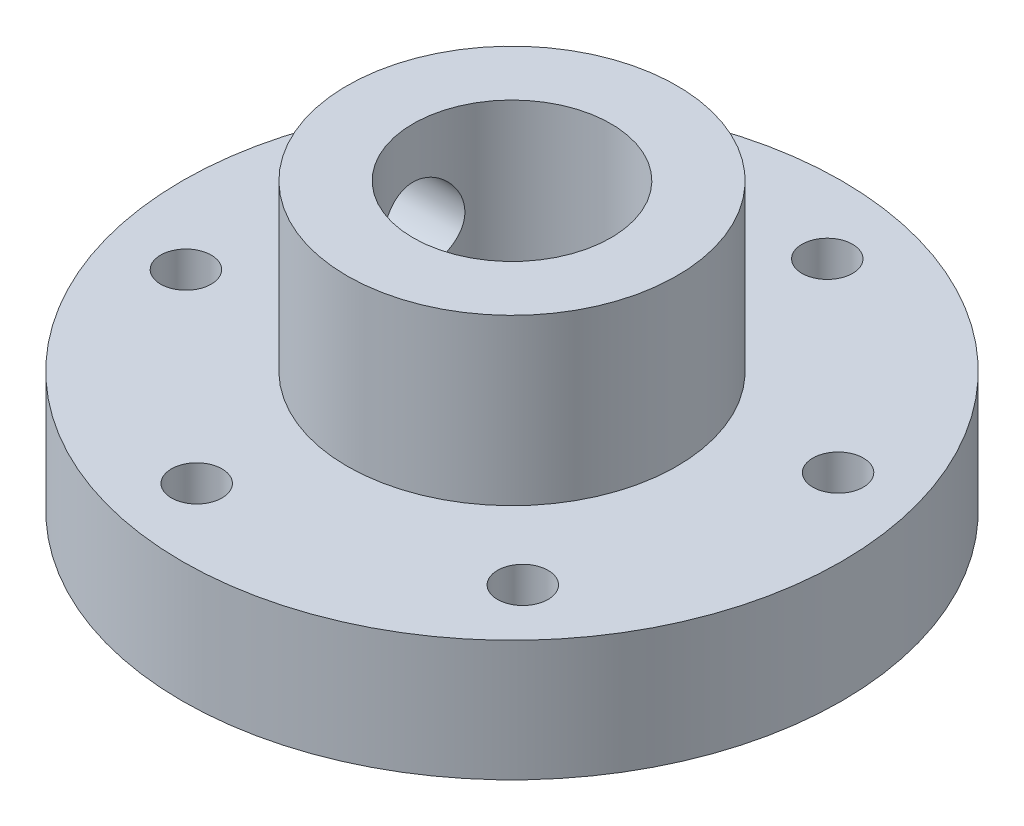
ISO-10303-21;
HEADER;
FILE_DESCRIPTION(('STEP AP214'),'2;1');
FILE_NAME('part.step','',(''),(''),'','','');
FILE_SCHEMA(('AUTOMOTIVE_DESIGN { 1 0 10303 214 1 1 1 1 }'));
ENDSEC;
DATA;
#1=APPLICATION_CONTEXT('core data for automotive mechanical design processes');
#2=APPLICATION_PROTOCOL_DEFINITION('international standard','automotive_design',2000,#1);
#3=PRODUCT_CONTEXT('',#1,'mechanical');
#4=PRODUCT('Part','Part','',(#3));
#5=PRODUCT_RELATED_PRODUCT_CATEGORY('part','',(#4));
#6=PRODUCT_DEFINITION_FORMATION('','',#4);
#7=PRODUCT_DEFINITION_CONTEXT('part definition',#1,'design');
#8=PRODUCT_DEFINITION('design','',#6,#7);
#9=PRODUCT_DEFINITION_SHAPE('','',#8);
#10=(LENGTH_UNIT() NAMED_UNIT(*) SI_UNIT(.MILLI.,.METRE.));
#11=(NAMED_UNIT(*) PLANE_ANGLE_UNIT() SI_UNIT($,.RADIAN.));
#12=(NAMED_UNIT(*) SI_UNIT($,.STERADIAN.) SOLID_ANGLE_UNIT());
#13=UNCERTAINTY_MEASURE_WITH_UNIT(LENGTH_MEASURE(1.E-05),#10,'distance_accuracy_value','');
#14=(GEOMETRIC_REPRESENTATION_CONTEXT(3) GLOBAL_UNCERTAINTY_ASSIGNED_CONTEXT((#13)) GLOBAL_UNIT_ASSIGNED_CONTEXT((#10,
#11,#12)) REPRESENTATION_CONTEXT('',''));
#15=CARTESIAN_POINT('',(0.,0.,0.));
#16=DIRECTION('',(0.,0.,1.));
#17=DIRECTION('',(1.,0.,0.));
#18=AXIS2_PLACEMENT_3D('',#15,#16,#17);
#19=CARTESIAN_POINT('',(0.,26.,0.));
#20=DIRECTION('',(0.,-1.,0.));
#21=DIRECTION('',(0.,0.,-1.));
#22=AXIS2_PLACEMENT_3D('',#19,#20,#21);
#23=CYLINDRICAL_SURFACE('',#22,15.);
#24=CARTESIAN_POINT('',(-14.4974997844456,17.55,-3.85));
#25=CARTESIAN_POINT('',(-14.4975037139503,17.3376015203786,-3.84999430899395));
#26=CARTESIAN_POINT('',(-14.5022184571044,17.1251411774259,-3.83236358588988));
#27=CARTESIAN_POINT('',(-14.520516628721,16.7063352871304,-3.76242726631808));
#28=CARTESIAN_POINT('',(-14.5341049370814,16.4999931697351,-3.71010259013421));
#29=CARTESIAN_POINT('',(-14.5685121748504,16.0995423274894,-3.57259453015927));
#30=CARTESIAN_POINT('',(-14.5893214406448,15.9054176604835,-3.4874550447748));
#31=CARTESIAN_POINT('',(-14.6358137715695,15.534182337845,-3.28686941082969));
#32=CARTESIAN_POINT('',(-14.6614971117621,15.3570726432809,-3.17142155171345));
#33=CARTESIAN_POINT('',(-14.7155105887127,15.0207885395624,-2.91063601549345));
#34=CARTESIAN_POINT('',(-14.7438848587797,14.862066889047,-2.76472352815352));
#35=CARTESIAN_POINT('',(-14.799701043376,14.5710584910169,-2.4483880228334));
#36=CARTESIAN_POINT('',(-14.8271428668753,14.4387743183393,-2.27796262023287));
#37=CARTESIAN_POINT('',(-14.8784921458645,14.2025295636584,-1.91432245364396));
#38=CARTESIAN_POINT('',(-14.9023414551622,14.0990158607544,-1.72080844506311));
#39=CARTESIAN_POINT('',(-14.9433139052101,13.9261594865703,-1.31841121467282));
#40=CARTESIAN_POINT('',(-14.9604380937017,13.8568114920092,-1.10953039296401));
#41=CARTESIAN_POINT('',(-14.98571884976,13.7557112160842,-0.687051274584021));
#42=CARTESIAN_POINT('',(-14.9940586719199,13.7231895524239,-0.473648249319008));
#43=CARTESIAN_POINT('',(-15.001470456539,13.6942478743522,-0.0442632423387412));
#44=CARTESIAN_POINT('',(-15.0005438602807,13.6978222456277,0.17171833309387));
#45=CARTESIAN_POINT('',(-14.9896627828382,13.7404223538562,0.594785918147083));
#46=CARTESIAN_POINT('',(-14.9799198720509,13.7786173156604,0.801961846365691));
#47=CARTESIAN_POINT('',(-14.9527485285787,13.888036360168,1.20685930692514));
#48=CARTESIAN_POINT('',(-14.9353196747754,13.9592622526708,1.40458032056642));
#49=CARTESIAN_POINT('',(-14.894414981847,14.1333794895608,1.78711738569415));
#50=CARTESIAN_POINT('',(-14.8708838501515,14.2365621475402,1.97179468629045));
#51=CARTESIAN_POINT('',(-14.8203204300093,14.4714419522582,2.32150106617554));
#52=CARTESIAN_POINT('',(-14.7932875036395,14.6031442973811,2.48652655494847));
#53=CARTESIAN_POINT('',(-14.7377511083542,14.8957615872166,2.79720131836368));
#54=CARTESIAN_POINT('',(-14.709227686086,15.0574019968988,2.94216448659244));
#55=CARTESIAN_POINT('',(-14.6546260480011,15.4029960697932,3.203085215457));
#56=CARTESIAN_POINT('',(-14.6285479595765,15.5869508943551,3.31904126546007));
#57=CARTESIAN_POINT('',(-14.5817147172228,15.973353354542,3.51912772865034));
#58=CARTESIAN_POINT('',(-14.5609887727474,16.1758946181966,3.60308464229615));
#59=CARTESIAN_POINT('',(-14.5275762527471,16.5928792500669,3.73553816676361));
#60=CARTESIAN_POINT('',(-14.514887850762,16.8073199021972,3.78404283417946));
#61=CARTESIAN_POINT('',(-14.4993726775743,17.2356320920044,3.84305925622214));
#62=CARTESIAN_POINT('',(-14.4962817467733,17.4493539553203,3.85458900417279));
#63=CARTESIAN_POINT('',(-14.4995909869353,17.875669579587,3.84212226821067));
#64=CARTESIAN_POINT('',(-14.5059902312956,18.0882634486391,3.81812925267343));
#65=CARTESIAN_POINT('',(-14.5273048505549,18.5024526915833,3.7361925990618));
#66=CARTESIAN_POINT('',(-14.5420695510912,18.7041753026663,3.67884918015974));
#67=CARTESIAN_POINT('',(-14.5783067907539,19.0951428052326,3.5325086500853));
#68=CARTESIAN_POINT('',(-14.5997801570503,19.2843861545522,3.44350763538369));
#69=CARTESIAN_POINT('',(-14.6475658907816,19.6493152229506,3.23427284629789));
#70=CARTESIAN_POINT('',(-14.6739686497703,19.8246423159,3.11343469625331));
#71=CARTESIAN_POINT('',(-14.7284200895009,20.1529045659824,2.84471404476546));
#72=CARTESIAN_POINT('',(-14.7564690554265,20.3058358271983,2.69682684798375));
#73=CARTESIAN_POINT('',(-14.8119533250863,20.5891290069732,2.37351964867547));
#74=CARTESIAN_POINT('',(-14.8393526019766,20.7187844577081,2.19747324888323));
#75=CARTESIAN_POINT('',(-14.8896826089327,20.9466960698138,1.82551885201202));
#76=CARTESIAN_POINT('',(-14.9126135747932,21.0449538882265,1.62961190381267));
#77=CARTESIAN_POINT('',(-14.9512769936742,21.2064068060799,1.22486581191567));
#78=CARTESIAN_POINT('',(-14.9670619792425,21.2698585333664,1.01613429424665));
#79=CARTESIAN_POINT('',(-14.989885389569,21.3606590876231,0.590509527171724));
#80=CARTESIAN_POINT('',(-14.9969255999834,21.3880152852607,0.373617953346712));
#81=CARTESIAN_POINT('',(-15.0013888293896,21.4054149831773,-0.0555479586559406));
#82=CARTESIAN_POINT('',(-14.9990799277905,21.39649854191,-0.267777963172668));
#83=CARTESIAN_POINT('',(-14.9857034672328,21.3440011305838,-0.687609264505827));
#84=CARTESIAN_POINT('',(-14.9746361949315,21.3004212950411,-0.895210712584056));
#85=CARTESIAN_POINT('',(-14.9450326673483,21.1804042203817,-1.29873918191618));
#86=CARTESIAN_POINT('',(-14.9265412653498,21.1041641179781,-1.49472834185828));
#87=CARTESIAN_POINT('',(-14.8840311394528,20.9211681545754,-1.87124446236686));
#88=CARTESIAN_POINT('',(-14.8600116867476,20.8144082694622,-2.05176937984991));
#89=CARTESIAN_POINT('',(-14.8082764327646,20.5702816171444,-2.39712940196516));
#90=CARTESIAN_POINT('',(-14.7804831399987,20.4322154413138,-2.56145849232353));
#91=CARTESIAN_POINT('',(-14.7246671328675,20.1307409562635,-2.86496826967628));
#92=CARTESIAN_POINT('',(-14.6966443613523,19.9673261404028,-3.0041424798495));
#93=CARTESIAN_POINT('',(-14.6429030154051,19.6158702926653,-3.25612651514469));
#94=CARTESIAN_POINT('',(-14.6172415473049,19.4274030894694,-3.3683551239696));
#95=CARTESIAN_POINT('',(-14.5719109818221,19.0336422168708,-3.55936993771995));
#96=CARTESIAN_POINT('',(-14.5522376979598,18.8283604309518,-3.63817952189235));
#97=CARTESIAN_POINT('',(-14.5240520078445,18.4446584138712,-3.74893866089505));
#98=CARTESIAN_POINT('',(-14.514172029791,18.2680088297946,-3.78675159544319));
#99=CARTESIAN_POINT('',(-14.5008945592867,17.9109208100685,-3.83728348012284));
#100=CARTESIAN_POINT('',(-14.4974964454021,17.7304827393086,-3.85000483585553));
#101=CARTESIAN_POINT('',(-14.4974997844456,17.55,-3.85));
#102=B_SPLINE_CURVE_WITH_KNOTS('',3,(#24,#25,#26,#27,#28,#29,#30,#31,#32,#33,#34,#35,#36,#37,
#38,#39,#40,#41,#42,#43,#44,#45,#46,#47,#48,#49,#50,#51,#52,#53,#54,#55,#56,#57,#58,#59,#60,#61,
#62,#63,#64,#65,#66,#67,#68,#69,#70,#71,#72,#73,#74,#75,#76,#77,#78,#79,#80,#81,#82,#83,#84,#85,
#86,#87,#88,#89,#90,#91,#92,#93,#94,#95,#96,#97,#98,#99,#100,#101),.UNSPECIFIED.,.T.,.F.,(4,2,2,
2,2,2,2,2,2,2,2,2,2,2,2,2,2,2,2,2,2,2,2,2,2,2,2,2,2,2,2,2,2,2,2,2,2,2,4),(0.,0.636532312885022,
1.27341497328203,1.90944857694809,2.54551808504196,3.19489519736624,3.84433552397912,
4.50336166615769,5.16228509448039,5.8071723867436,6.45195937592793,7.08167181769272,
7.71141876613835,8.34708433633667,8.98286586922013,9.63676369351051,10.2906955644066,
10.9481242588056,11.6054035047209,12.2444238565188,12.8833818196909,13.5111812443457,
14.1390581064483,14.7798407481066,15.4207347264697,16.0786329564693,16.7364964594861,
17.389441958157,18.0422541054325,18.6764817995508,19.3106887365586,19.9411203879185,
20.5716352017304,21.2179368813546,21.864404732938,22.5237666838852,23.1826665950206,
23.723603194257,24.2644879298385),.UNSPECIFIED.);
#103=CARTESIAN_POINT('',(-14.4974997844456,17.55,-3.85));
#104=VERTEX_POINT('',#103);
#105=EDGE_CURVE('E68',#104,#104,#102,.T.);
#106=ORIENTED_EDGE('',*,*,#105,.F.);
#107=EDGE_LOOP('',(#106));
#108=FACE_BOUND('',#107,.T.);
#109=CARTESIAN_POINT('',(0.,11.,0.));
#110=DIRECTION('',(0.,1.,0.));
#111=DIRECTION('',(0.,0.,1.));
#112=AXIS2_PLACEMENT_3D('',#109,#110,#111);
#113=CIRCLE('',#112,15.);
#114=CARTESIAN_POINT('',(0.,11.,15.));
#115=VERTEX_POINT('',#114);
#116=EDGE_CURVE('E37',#115,#115,#113,.T.);
#117=ORIENTED_EDGE('',*,*,#116,.T.);
#118=EDGE_LOOP('',(#117));
#119=FACE_BOUND('',#118,.T.);
#120=CARTESIAN_POINT('',(0.,26.,0.));
#121=DIRECTION('',(0.,1.,0.));
#122=DIRECTION('',(0.,0.,1.));
#123=AXIS2_PLACEMENT_3D('',#120,#121,#122);
#124=CIRCLE('',#123,15.);
#125=CARTESIAN_POINT('',(0.,26.,15.));
#126=VERTEX_POINT('',#125);
#127=EDGE_CURVE('E10',#126,#126,#124,.T.);
#128=ORIENTED_EDGE('',*,*,#127,.F.);
#129=EDGE_LOOP('',(#128));
#130=FACE_BOUND('',#129,.T.);
#131=ADVANCED_FACE('F34',(#108,#119,#130),#23,.T.);
#132=CARTESIAN_POINT('',(0.,26.,0.));
#133=DIRECTION('',(0.,1.,0.));
#134=DIRECTION('',(0.,0.,1.));
#135=AXIS2_PLACEMENT_3D('',#132,#133,#134);
#136=PLANE('',#135);
#137=CARTESIAN_POINT('',(0.,26.,0.));
#138=DIRECTION('',(0.,1.,0.));
#139=DIRECTION('',(0.,0.,1.));
#140=AXIS2_PLACEMENT_3D('',#137,#138,#139);
#141=CIRCLE('',#140,9.);
#142=CARTESIAN_POINT('',(0.,26.,9.));
#143=VERTEX_POINT('',#142);
#144=EDGE_CURVE('E52',#143,#143,#141,.T.);
#145=ORIENTED_EDGE('',*,*,#144,.F.);
#146=EDGE_LOOP('',(#145));
#147=FACE_BOUND('',#146,.T.);
#148=ORIENTED_EDGE('',*,*,#127,.T.);
#149=EDGE_LOOP('',(#148));
#150=FACE_BOUND('',#149,.T.);
#151=ADVANCED_FACE('F150',(#147,#150),#136,.T.);
#152=CARTESIAN_POINT('',(0.,11.,0.));
#153=DIRECTION('',(0.,-1.,0.));
#154=DIRECTION('',(0.,0.,-1.));
#155=AXIS2_PLACEMENT_3D('',#152,#153,#154);
#156=CYLINDRICAL_SURFACE('',#155,30.);
#157=CARTESIAN_POINT('',(0.,11.,0.));
#158=DIRECTION('',(0.,1.,0.));
#159=DIRECTION('',(0.,0.,1.));
#160=AXIS2_PLACEMENT_3D('',#157,#158,#159);
#161=CIRCLE('',#160,30.);
#162=CARTESIAN_POINT('',(0.,11.,30.));
#163=VERTEX_POINT('',#162);
#164=EDGE_CURVE('E44',#163,#163,#161,.T.);
#165=ORIENTED_EDGE('',*,*,#164,.F.);
#166=EDGE_LOOP('',(#165));
#167=FACE_BOUND('',#166,.T.);
#168=CARTESIAN_POINT('',(0.,0.,0.));
#169=DIRECTION('',(0.,1.,0.));
#170=DIRECTION('',(0.,0.,1.));
#171=AXIS2_PLACEMENT_3D('',#168,#169,#170);
#172=CIRCLE('',#171,30.);
#173=CARTESIAN_POINT('',(0.,0.,30.));
#174=VERTEX_POINT('',#173);
#175=EDGE_CURVE('E46',#174,#174,#172,.T.);
#176=ORIENTED_EDGE('',*,*,#175,.T.);
#177=EDGE_LOOP('',(#176));
#178=FACE_BOUND('',#177,.T.);
#179=ADVANCED_FACE('F146',(#167,#178),#156,.T.);
#180=CARTESIAN_POINT('',(0.,11.,0.));
#181=DIRECTION('',(0.,1.,0.));
#182=DIRECTION('',(0.,0.,1.));
#183=AXIS2_PLACEMENT_3D('',#180,#181,#182);
#184=PLANE('',#183);
#185=CARTESIAN_POINT('',(-17.3377335773735,11.,-16.3550642424516));
#186=DIRECTION('',(0.,1.,0.));
#187=DIRECTION('',(0.86602540378444,0.,0.499999999999998));
#188=AXIS2_PLACEMENT_3D('',#185,#186,#187);
#189=CIRCLE('',#188,2.3);
#190=CARTESIAN_POINT('',(-15.3458751486692,11.,-15.2050642424516));
#191=VERTEX_POINT('',#190);
#192=EDGE_CURVE('E89',#191,#191,#189,.T.);
#193=ORIENTED_EDGE('',*,*,#192,.F.);
#194=EDGE_LOOP('',(#193));
#195=FACE_BOUND('',#194,.T.);
#196=CARTESIAN_POINT('',(-22.8327679031763,11.,6.83738560082613));
#197=DIRECTION('',(0.,1.,0.));
#198=DIRECTION('',(0.866025403784436,0.,-0.500000000000004));
#199=AXIS2_PLACEMENT_3D('',#196,#197,#198);
#200=CIRCLE('',#199,2.3);
#201=CARTESIAN_POINT('',(-20.8409094744721,11.,5.68738560082612));
#202=VERTEX_POINT('',#201);
#203=EDGE_CURVE('E83',#202,#202,#200,.T.);
#204=ORIENTED_EDGE('',*,*,#203,.F.);
#205=EDGE_LOOP('',(#204));
#206=FACE_BOUND('',#205,.T.);
#207=CARTESIAN_POINT('',(-5.49503432580289,11.,23.1924498432776));
#208=DIRECTION('',(0.,1.,0.));
#209=DIRECTION('',(0.,0.,-1.));
#210=AXIS2_PLACEMENT_3D('',#207,#208,#209);
#211=CIRCLE('',#210,2.3);
#212=CARTESIAN_POINT('',(-5.49503432580289,11.,20.8924498432776));
#213=VERTEX_POINT('',#212);
#214=EDGE_CURVE('E77',#213,#213,#211,.T.);
#215=ORIENTED_EDGE('',*,*,#214,.F.);
#216=EDGE_LOOP('',(#215));
#217=FACE_BOUND('',#216,.T.);
#218=CARTESIAN_POINT('',(17.3377335773736,11.,16.3550642424515));
#219=DIRECTION('',(0.,1.,0.));
#220=DIRECTION('',(-0.866025403784443,0.,-0.499999999999992));
#221=AXIS2_PLACEMENT_3D('',#218,#219,#220);
#222=CIRCLE('',#221,2.3);
#223=CARTESIAN_POINT('',(15.3458751486694,11.,15.2050642424515));
#224=VERTEX_POINT('',#223);
#225=EDGE_CURVE('E71',#224,#224,#222,.T.);
#226=ORIENTED_EDGE('',*,*,#225,.F.);
#227=EDGE_LOOP('',(#226));
#228=FACE_BOUND('',#227,.T.);
#229=CARTESIAN_POINT('',(22.8327679031762,11.,-6.83738560082629));
#230=DIRECTION('',(0.,1.,0.));
#231=DIRECTION('',(-0.866025403784433,0.,0.50000000000001));
#232=AXIS2_PLACEMENT_3D('',#229,#230,#231);
#233=CIRCLE('',#232,2.3);
#234=CARTESIAN_POINT('',(20.840909474472,11.,-5.68738560082627));
#235=VERTEX_POINT('',#234);
#236=EDGE_CURVE('E64',#235,#235,#233,.T.);
#237=ORIENTED_EDGE('',*,*,#236,.F.);
#238=EDGE_LOOP('',(#237));
#239=FACE_BOUND('',#238,.T.);
#240=CARTESIAN_POINT('',(5.49503432580289,11.,-23.1924498432776));
#241=DIRECTION('',(0.,1.,0.));
#242=DIRECTION('',(0.,0.,1.));
#243=AXIS2_PLACEMENT_3D('',#240,#241,#242);
#244=CIRCLE('',#243,2.3);
#245=CARTESIAN_POINT('',(5.49503432580289,11.,-20.8924498432776));
#246=VERTEX_POINT('',#245);
#247=EDGE_CURVE('E58',#246,#246,#244,.T.);
#248=ORIENTED_EDGE('',*,*,#247,.F.);
#249=EDGE_LOOP('',(#248));
#250=FACE_BOUND('',#249,.T.);
#251=ORIENTED_EDGE('',*,*,#116,.F.);
#252=EDGE_LOOP('',(#251));
#253=FACE_BOUND('',#252,.T.);
#254=ORIENTED_EDGE('',*,*,#164,.T.);
#255=EDGE_LOOP('',(#254));
#256=FACE_BOUND('',#255,.T.);
#257=ADVANCED_FACE('F143',(#195,#206,#217,#228,#239,#250,#253,#256),#184,.T.);
#258=CARTESIAN_POINT('',(0.,0.,0.));
#259=DIRECTION('',(0.,1.,0.));
#260=DIRECTION('',(0.,0.,1.));
#261=AXIS2_PLACEMENT_3D('',#258,#259,#260);
#262=PLANE('',#261);
#263=CARTESIAN_POINT('',(-17.3377335773735,0.,-16.3550642424516));
#264=DIRECTION('',(0.,1.,0.));
#265=DIRECTION('',(0.86602540378444,0.,0.499999999999998));
#266=AXIS2_PLACEMENT_3D('',#263,#264,#265);
#267=CIRCLE('',#266,2.3);
#268=CARTESIAN_POINT('',(-15.3458751486692,0.,-15.2050642424516));
#269=VERTEX_POINT('',#268);
#270=EDGE_CURVE('E61',#269,#269,#267,.T.);
#271=ORIENTED_EDGE('',*,*,#270,.T.);
#272=EDGE_LOOP('',(#271));
#273=FACE_BOUND('',#272,.T.);
#274=CARTESIAN_POINT('',(-22.8327679031763,0.,6.83738560082613));
#275=DIRECTION('',(0.,1.,0.));
#276=DIRECTION('',(0.866025403784436,0.,-0.500000000000004));
#277=AXIS2_PLACEMENT_3D('',#274,#275,#276);
#278=CIRCLE('',#277,2.3);
#279=CARTESIAN_POINT('',(-20.8409094744721,0.,5.68738560082612));
#280=VERTEX_POINT('',#279);
#281=EDGE_CURVE('E86',#280,#280,#278,.T.);
#282=ORIENTED_EDGE('',*,*,#281,.T.);
#283=EDGE_LOOP('',(#282));
#284=FACE_BOUND('',#283,.T.);
#285=CARTESIAN_POINT('',(-5.49503432580289,0.,23.1924498432776));
#286=DIRECTION('',(0.,1.,0.));
#287=DIRECTION('',(0.,0.,-1.));
#288=AXIS2_PLACEMENT_3D('',#285,#286,#287);
#289=CIRCLE('',#288,2.3);
#290=CARTESIAN_POINT('',(-5.49503432580289,0.,20.8924498432776));
#291=VERTEX_POINT('',#290);
#292=EDGE_CURVE('E80',#291,#291,#289,.T.);
#293=ORIENTED_EDGE('',*,*,#292,.T.);
#294=EDGE_LOOP('',(#293));
#295=FACE_BOUND('',#294,.T.);
#296=CARTESIAN_POINT('',(17.3377335773736,0.,16.3550642424515));
#297=DIRECTION('',(0.,1.,0.));
#298=DIRECTION('',(-0.866025403784443,0.,-0.499999999999992));
#299=AXIS2_PLACEMENT_3D('',#296,#297,#298);
#300=CIRCLE('',#299,2.3);
#301=CARTESIAN_POINT('',(15.3458751486694,0.,15.2050642424515));
#302=VERTEX_POINT('',#301);
#303=EDGE_CURVE('E74',#302,#302,#300,.T.);
#304=ORIENTED_EDGE('',*,*,#303,.T.);
#305=EDGE_LOOP('',(#304));
#306=FACE_BOUND('',#305,.T.);
#307=CARTESIAN_POINT('',(22.8327679031762,0.,-6.83738560082629));
#308=DIRECTION('',(0.,1.,0.));
#309=DIRECTION('',(-0.866025403784433,0.,0.50000000000001));
#310=AXIS2_PLACEMENT_3D('',#307,#308,#309);
#311=CIRCLE('',#310,2.3);
#312=CARTESIAN_POINT('',(20.840909474472,0.,-5.68738560082627));
#313=VERTEX_POINT('',#312);
#314=EDGE_CURVE('E67',#313,#313,#311,.T.);
#315=ORIENTED_EDGE('',*,*,#314,.T.);
#316=EDGE_LOOP('',(#315));
#317=FACE_BOUND('',#316,.T.);
#318=CARTESIAN_POINT('',(5.49503432580289,0.,-23.1924498432776));
#319=DIRECTION('',(0.,1.,0.));
#320=DIRECTION('',(0.,0.,1.));
#321=AXIS2_PLACEMENT_3D('',#318,#319,#320);
#322=CIRCLE('',#321,2.3);
#323=CARTESIAN_POINT('',(5.49503432580289,0.,-20.8924498432776));
#324=VERTEX_POINT('',#323);
#325=EDGE_CURVE('E55',#324,#324,#322,.T.);
#326=ORIENTED_EDGE('',*,*,#325,.T.);
#327=EDGE_LOOP('',(#326));
#328=FACE_BOUND('',#327,.T.);
#329=CARTESIAN_POINT('',(0.,0.,0.));
#330=DIRECTION('',(0.,1.,0.));
#331=DIRECTION('',(0.,0.,1.));
#332=AXIS2_PLACEMENT_3D('',#329,#330,#331);
#333=CIRCLE('',#332,9.);
#334=CARTESIAN_POINT('',(0.,0.,9.));
#335=VERTEX_POINT('',#334);
#336=EDGE_CURVE('E49',#335,#335,#333,.T.);
#337=ORIENTED_EDGE('',*,*,#336,.T.);
#338=EDGE_LOOP('',(#337));
#339=FACE_BOUND('',#338,.T.);
#340=ORIENTED_EDGE('',*,*,#175,.F.);
#341=EDGE_LOOP('',(#340));
#342=FACE_BOUND('',#341,.T.);
#343=ADVANCED_FACE('F141',(#273,#284,#295,#306,#317,#328,#339,#342),#262,.F.);
#344=CARTESIAN_POINT('',(0.,0.,0.));
#345=DIRECTION('',(0.,1.,0.));
#346=DIRECTION('',(0.,0.,1.));
#347=AXIS2_PLACEMENT_3D('',#344,#345,#346);
#348=CYLINDRICAL_SURFACE('',#347,9.);
#349=CARTESIAN_POINT('',(-8.13495543933708,17.55,-3.85));
#350=CARTESIAN_POINT('',(-8.1349562814349,17.6524312523983,-3.84999919988478));
#351=CARTESIAN_POINT('',(-8.13689690890917,17.754895890698,-3.84590602811421));
#352=CARTESIAN_POINT('',(-8.14459436774536,17.9590733297407,-3.82957713641106));
#353=CARTESIAN_POINT('',(-8.1503536040522,18.0607856158098,-3.81733628508284));
#354=CARTESIAN_POINT('',(-8.16550748809787,18.2628659650428,-3.78481320221164));
#355=CARTESIAN_POINT('',(-8.17490963600848,18.3632308100593,-3.76451437846277));
#356=CARTESIAN_POINT('',(-8.19702873719036,18.5616982610533,-3.71610283543133));
#357=CARTESIAN_POINT('',(-8.20974708977661,18.6597998929726,-3.68798681725065));
#358=CARTESIAN_POINT('',(-8.25215754786032,18.9488117434224,-3.59259967147734));
#359=CARTESIAN_POINT('',(-8.28619361323957,19.135517355984,-3.51411103051789));
#360=CARTESIAN_POINT('',(-8.36193444674092,19.4929621722662,-3.32985216216194));
#361=CARTESIAN_POINT('',(-8.40363768834868,19.6637045440356,-3.22408736369049));
#362=CARTESIAN_POINT('',(-8.49308235286607,19.9958166210063,-2.9808223565165));
#363=CARTESIAN_POINT('',(-8.54103548681777,20.1560219894256,-2.84180691188171));
#364=CARTESIAN_POINT('',(-8.63584021098423,20.4517051980444,-2.53917266907089));
#365=CARTESIAN_POINT('',(-8.68269135646897,20.587173199234,-2.37554412829742));
#366=CARTESIAN_POINT('',(-8.77260977109294,20.8356083463329,-2.01905782143798));
#367=CARTESIAN_POINT('',(-8.81540259736964,20.947248415335,-1.82519957000285));
#368=CARTESIAN_POINT('',(-8.88977410294051,21.1358226819096,-1.41929085343678));
#369=CARTESIAN_POINT('',(-8.92135801420945,21.2127730760942,-1.20724893341961));
#370=CARTESIAN_POINT('',(-8.96824967612307,21.3255111107019,-0.783248375130546));
#371=CARTESIAN_POINT('',(-8.98435065774373,21.3633135397196,-0.571915001760905));
#372=CARTESIAN_POINT('',(-9.00135353563875,21.4032081820046,-0.145333023989322));
#373=CARTESIAN_POINT('',(-9.00226195101378,21.4053157118886,0.0699138614376738));
#374=CARTESIAN_POINT('',(-8.98923345274841,21.3747827415668,0.483503347341973));
#375=CARTESIAN_POINT('',(-8.97624416079305,21.344360388984,0.68204527182749));
#376=CARTESIAN_POINT('',(-8.93819752059243,21.2534540093359,1.07088919649578));
#377=CARTESIAN_POINT('',(-8.91313928064248,21.1929677610129,1.26119058670069));
#378=CARTESIAN_POINT('',(-8.85287832872666,21.0429542054036,1.63166742736321));
#379=CARTESIAN_POINT('',(-8.81752625357953,20.9529966750869,1.81164337158245));
#380=CARTESIAN_POINT('',(-8.74010319698026,20.7470299849428,2.15441866925713));
#381=CARTESIAN_POINT('',(-8.69802980558589,20.6310114748134,2.31721182688722));
#382=CARTESIAN_POINT('',(-8.60769192592747,20.3662829385414,2.63376112685631));
#383=CARTESIAN_POINT('',(-8.55919968377037,20.2157932885637,2.78596607575638));
#384=CARTESIAN_POINT('',(-8.46377710461413,19.8913754420044,3.06367163292623));
#385=CARTESIAN_POINT('',(-8.41684744413966,19.7174372537036,3.189160798145));
#386=CARTESIAN_POINT('',(-8.32818529877439,19.3431382576775,3.4141641034592));
#387=CARTESIAN_POINT('',(-8.28670259797717,19.142048648893,3.51257289859854));
#388=CARTESIAN_POINT('',(-8.21664611941293,18.7239085382459,3.67348867694061));
#389=CARTESIAN_POINT('',(-8.188062536148,18.5068703064622,3.73602294066022));
#390=CARTESIAN_POINT('',(-8.14951067044971,18.0785661945476,3.8193532289855));
#391=CARTESIAN_POINT('',(-8.13841905165514,17.8678948482962,3.84267497859925));
#392=CARTESIAN_POINT('',(-8.13288991481515,17.4454019701394,3.85437020106798));
#393=CARTESIAN_POINT('',(-8.13844609596675,17.2335809036673,3.84275689601761));
#394=CARTESIAN_POINT('',(-8.16442092815148,16.8302425418703,3.78721966176508));
#395=CARTESIAN_POINT('',(-8.18378631637541,16.6383335101085,3.74558327610998));
#396=CARTESIAN_POINT('',(-8.23382480460214,16.2644057175734,3.63425717666648));
#397=CARTESIAN_POINT('',(-8.2645006442124,16.0823893652622,3.56456066580322));
#398=CARTESIAN_POINT('',(-8.3353204504403,15.7245694250091,3.39575193225376));
#399=CARTESIAN_POINT('',(-8.37581760812991,15.5493784849051,3.29549415933176));
#400=CARTESIAN_POINT('',(-8.46123953702969,15.2174363870074,3.0695279676191));
#401=CARTESIAN_POINT('',(-8.50616629056226,15.0606935545324,2.94380812733044));
#402=CARTESIAN_POINT('',(-8.60008325531371,14.7559436563054,2.65765383141866));
#403=CARTESIAN_POINT('',(-8.64908809286592,14.6098718723257,2.495154758758));
#404=CARTESIAN_POINT('',(-8.74205427618436,14.3466899287454,2.14684557460134));
#405=CARTESIAN_POINT('',(-8.78601512614879,14.2295826149197,1.96103317525955));
#406=CARTESIAN_POINT('',(-8.86433816602128,14.0275399398195,1.56955162744401));
#407=CARTESIAN_POINT('',(-8.89865380663941,13.9427599172194,1.36379241721413));
#408=CARTESIAN_POINT('',(-8.95342699069036,13.8096698227282,0.939077828200709));
#409=CARTESIAN_POINT('',(-8.97389327668717,13.7613367410795,0.720130869587034));
#410=CARTESIAN_POINT('',(-8.99760714510122,13.705522740243,0.292503724320114));
#411=CARTESIAN_POINT('',(-9.002002428965,13.6953176529639,0.0842405281442727));
#412=CARTESIAN_POINT('',(-8.99630638816658,13.7086365913559,-0.330978719495094));
#413=CARTESIAN_POINT('',(-8.98621785283671,13.7321541226345,-0.537935014936242));
#414=CARTESIAN_POINT('',(-8.95330726633262,13.8102956265188,-0.936343134094175));
#415=CARTESIAN_POINT('',(-8.93099560313635,13.8636744877694,-1.12808492272643));
#416=CARTESIAN_POINT('',(-8.87614526713446,13.9986279524201,-1.49979141392257));
#417=CARTESIAN_POINT('',(-8.84360470790134,14.0802077569549,-1.679753936735));
#418=CARTESIAN_POINT('',(-8.76957377618264,14.2733804873234,-2.03185080234128));
#419=CARTESIAN_POINT('',(-8.72774293473958,14.3861724569876,-2.20325388811248));
#420=CARTESIAN_POINT('',(-8.64002612185022,14.6368709048793,-2.52544551416142));
#421=CARTESIAN_POINT('',(-8.59413855586302,14.7747872813292,-2.67622588860719));
#422=CARTESIAN_POINT('',(-8.49928858737208,15.0835184978537,-2.9642405531547));
#423=CARTESIAN_POINT('',(-8.45034382727478,15.255991278787,-3.09970644022106));
#424=CARTESIAN_POINT('',(-8.35824398474331,15.6227975145582,-3.34012087518191));
#425=CARTESIAN_POINT('',(-8.3150922693329,15.8171435629489,-3.4450517165595));
#426=CARTESIAN_POINT('',(-8.25891464106905,16.1209711540871,-3.5766723665429));
#427=CARTESIAN_POINT('',(-8.24161888146385,16.2242553827595,-3.61623947624643));
#428=CARTESIAN_POINT('',(-8.21045300845798,16.4342963801588,-3.68645389862485));
#429=CARTESIAN_POINT('',(-8.19658120123716,16.5410514021926,-3.71710562306143));
#430=CARTESIAN_POINT('',(-8.17281876579371,16.7569343567084,-3.76906460754336));
#431=CARTESIAN_POINT('',(-8.16291765634792,16.8660552298409,-3.79039648216744));
#432=CARTESIAN_POINT('',(-8.14744169822321,17.0859803557364,-3.82354978279504));
#433=CARTESIAN_POINT('',(-8.14186353106625,17.1967832505505,-3.83537850408766));
#434=CARTESIAN_POINT('',(-8.13735799888921,17.3481993796227,-3.84491989963671));
#435=CARTESIAN_POINT('',(-8.13645774279731,17.3885285668498,-3.84682430165005));
#436=CARTESIAN_POINT('',(-8.13525629237584,17.4692367723929,-3.84936451939143));
#437=CARTESIAN_POINT('',(-8.13495510733437,17.5096157914717,-3.85000031545079));
#438=CARTESIAN_POINT('',(-8.13495543933708,17.55,-3.85));
#439=B_SPLINE_CURVE_WITH_KNOTS('',3,(#349,#350,#351,#352,#353,#354,#355,#356,#357,#358,#359,
#360,#361,#362,#363,#364,#365,#366,#367,#368,#369,#370,#371,#372,#373,#374,#375,#376,#377,#378,
#379,#380,#381,#382,#383,#384,#385,#386,#387,#388,#389,#390,#391,#392,#393,#394,#395,#396,#397,
#398,#399,#400,#401,#402,#403,#404,#405,#406,#407,#408,#409,#410,#411,#412,#413,#414,#415,#416,
#417,#418,#419,#420,#421,#422,#423,#424,#425,#426,#427,#428,#429,#430,#431,#432,#433,#434,#435,
#436,#437,#438),.UNSPECIFIED.,.T.,.F.,(4,2,2,2,2,2,2,2,2,2,2,2,2,2,2,2,2,2,2,2,2,2,2,2,2,2,2,2,
2,2,2,2,2,2,2,2,2,2,2,2,2,2,2,2,4),(0.,0.30725155801471,0.614696805898529,0.922778426957673,
1.23099025797095,1.84413629235552,2.45716038293987,3.10670465455333,3.75650671505187,
4.43629973277253,5.11577502551144,5.75821932065393,6.40038793712038,7.00140363408452,
7.60246374343271,8.21272126736568,8.823198093571,9.47868412568742,10.1344503568066,
10.8139666037038,11.4929654302895,12.1262680977804,12.7593311053012,13.3486601341898,
13.9381320037079,14.5531916423722,15.1685277913258,15.8372079673685,16.5059538155254,
17.177873788698,17.8493692080066,18.4718548552766,19.0942206386888,19.6923861469805,
20.2906620345867,20.9162214039754,21.5420277590752,22.21309493181,22.8845504678767,
23.2200143628497,23.5553119706116,23.8897185930344,24.2238682554493,24.3450023656556,
24.4661383539306),.UNSPECIFIED.);
#440=CARTESIAN_POINT('',(-8.13495543933708,17.55,-3.85));
#441=VERTEX_POINT('',#440);
#442=EDGE_CURVE('E101',#441,#441,#439,.T.);
#443=ORIENTED_EDGE('',*,*,#442,.F.);
#444=EDGE_LOOP('',(#443));
#445=FACE_BOUND('',#444,.T.);
#446=ORIENTED_EDGE('',*,*,#336,.F.);
#447=EDGE_LOOP('',(#446));
#448=FACE_BOUND('',#447,.T.);
#449=ORIENTED_EDGE('',*,*,#144,.T.);
#450=EDGE_LOOP('',(#449));
#451=FACE_BOUND('',#450,.T.);
#452=ADVANCED_FACE('F137',(#445,#448,#451),#348,.F.);
#453=CARTESIAN_POINT('',(5.49503432580289,0.,-23.1924498432776));
#454=DIRECTION('',(0.,1.,0.));
#455=DIRECTION('',(0.,0.,1.));
#456=AXIS2_PLACEMENT_3D('',#453,#454,#455);
#457=CYLINDRICAL_SURFACE('',#456,2.3);
#458=ORIENTED_EDGE('',*,*,#325,.F.);
#459=EDGE_LOOP('',(#458));
#460=FACE_BOUND('',#459,.T.);
#461=ORIENTED_EDGE('',*,*,#247,.T.);
#462=EDGE_LOOP('',(#461));
#463=FACE_BOUND('',#462,.T.);
#464=ADVANCED_FACE('F133',(#460,#463),#457,.F.);
#465=CARTESIAN_POINT('',(22.8327679031762,0.,-6.83738560082629));
#466=DIRECTION('',(0.,1.,0.));
#467=DIRECTION('',(0.,0.,1.));
#468=AXIS2_PLACEMENT_3D('',#465,#466,#467);
#469=CYLINDRICAL_SURFACE('',#468,2.3);
#470=ORIENTED_EDGE('',*,*,#314,.F.);
#471=EDGE_LOOP('',(#470));
#472=FACE_BOUND('',#471,.T.);
#473=ORIENTED_EDGE('',*,*,#236,.T.);
#474=EDGE_LOOP('',(#473));
#475=FACE_BOUND('',#474,.T.);
#476=ADVANCED_FACE('F129',(#472,#475),#469,.F.);
#477=CARTESIAN_POINT('',(17.3377335773736,0.,16.3550642424515));
#478=DIRECTION('',(0.,1.,0.));
#479=DIRECTION('',(0.,0.,1.));
#480=AXIS2_PLACEMENT_3D('',#477,#478,#479);
#481=CYLINDRICAL_SURFACE('',#480,2.3);
#482=ORIENTED_EDGE('',*,*,#303,.F.);
#483=EDGE_LOOP('',(#482));
#484=FACE_BOUND('',#483,.T.);
#485=ORIENTED_EDGE('',*,*,#225,.T.);
#486=EDGE_LOOP('',(#485));
#487=FACE_BOUND('',#486,.T.);
#488=ADVANCED_FACE('F125',(#484,#487),#481,.F.);
#489=CARTESIAN_POINT('',(-5.49503432580289,0.,23.1924498432776));
#490=DIRECTION('',(0.,1.,0.));
#491=DIRECTION('',(0.,0.,1.));
#492=AXIS2_PLACEMENT_3D('',#489,#490,#491);
#493=CYLINDRICAL_SURFACE('',#492,2.3);
#494=ORIENTED_EDGE('',*,*,#292,.F.);
#495=EDGE_LOOP('',(#494));
#496=FACE_BOUND('',#495,.T.);
#497=ORIENTED_EDGE('',*,*,#214,.T.);
#498=EDGE_LOOP('',(#497));
#499=FACE_BOUND('',#498,.T.);
#500=ADVANCED_FACE('F121',(#496,#499),#493,.F.);
#501=CARTESIAN_POINT('',(-22.8327679031763,0.,6.83738560082613));
#502=DIRECTION('',(0.,1.,0.));
#503=DIRECTION('',(0.,0.,1.));
#504=AXIS2_PLACEMENT_3D('',#501,#502,#503);
#505=CYLINDRICAL_SURFACE('',#504,2.3);
#506=ORIENTED_EDGE('',*,*,#281,.F.);
#507=EDGE_LOOP('',(#506));
#508=FACE_BOUND('',#507,.T.);
#509=ORIENTED_EDGE('',*,*,#203,.T.);
#510=EDGE_LOOP('',(#509));
#511=FACE_BOUND('',#510,.T.);
#512=ADVANCED_FACE('F117',(#508,#511),#505,.F.);
#513=CARTESIAN_POINT('',(-17.3377335773735,0.,-16.3550642424516));
#514=DIRECTION('',(0.,1.,0.));
#515=DIRECTION('',(0.,0.,1.));
#516=AXIS2_PLACEMENT_3D('',#513,#514,#515);
#517=CYLINDRICAL_SURFACE('',#516,2.3);
#518=ORIENTED_EDGE('',*,*,#270,.F.);
#519=EDGE_LOOP('',(#518));
#520=FACE_BOUND('',#519,.T.);
#521=ORIENTED_EDGE('',*,*,#192,.T.);
#522=EDGE_LOOP('',(#521));
#523=FACE_BOUND('',#522,.T.);
#524=ADVANCED_FACE('F112',(#520,#523),#517,.F.);
#525=CARTESIAN_POINT('',(-30.001,17.55,0.));
#526=DIRECTION('',(1.,0.,0.));
#527=DIRECTION('',(0.,0.,-1.));
#528=AXIS2_PLACEMENT_3D('',#525,#526,#527);
#529=CYLINDRICAL_SURFACE('',#528,3.85);
#530=ORIENTED_EDGE('',*,*,#442,.T.);
#531=EDGE_LOOP('',(#530));
#532=FACE_BOUND('',#531,.T.);
#533=ORIENTED_EDGE('',*,*,#105,.T.);
#534=EDGE_LOOP('',(#533));
#535=FACE_BOUND('',#534,.T.);
#536=ADVANCED_FACE('F106',(#532,#535),#529,.F.);
#537=CLOSED_SHELL('',(#131,#151,#179,#257,#343,#452,#464,#476,#488,#500,#512,#524,#536));
#538=MANIFOLD_SOLID_BREP('B2',#537);
#539=ADVANCED_BREP_SHAPE_REPRESENTATION('',(#18,#538),#14);
#540=SHAPE_DEFINITION_REPRESENTATION(#9,#539);
ENDSEC;
END-ISO-10303-21;
